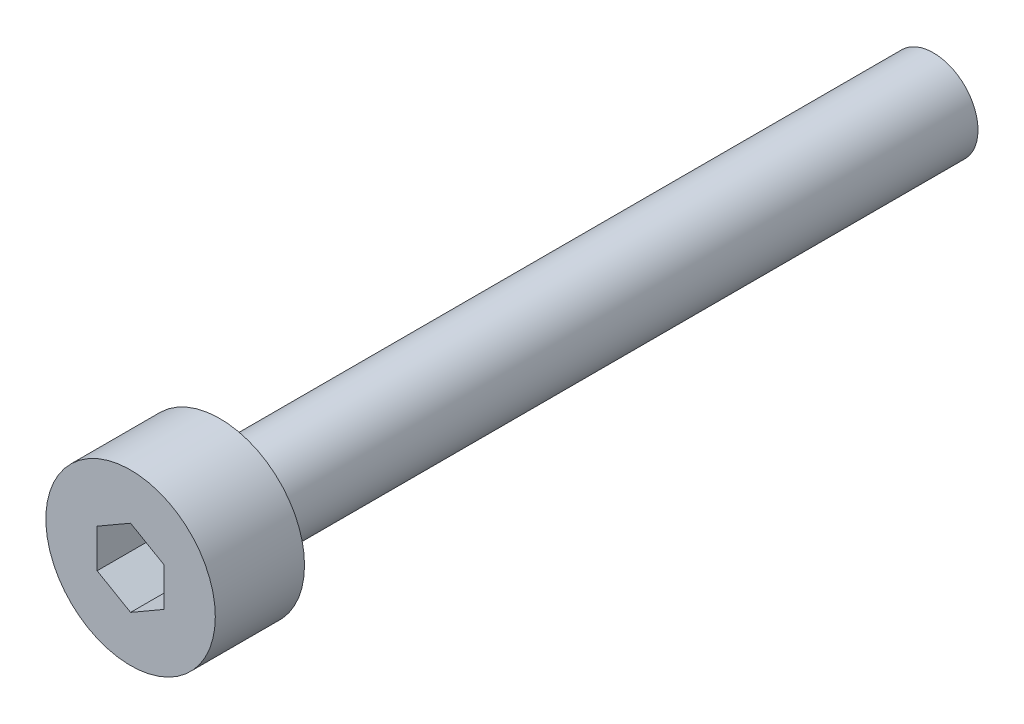
ISO-10303-21;
HEADER;
FILE_DESCRIPTION(('STEP AP214'),'2;1');
FILE_NAME('part.step','',(''),(''),'','','');
FILE_SCHEMA(('AUTOMOTIVE_DESIGN { 1 0 10303 214 1 1 1 1 }'));
ENDSEC;
DATA;
#1=APPLICATION_CONTEXT('core data for automotive mechanical design processes');
#2=APPLICATION_PROTOCOL_DEFINITION('international standard','automotive_design',2000,#1);
#3=PRODUCT_CONTEXT('',#1,'mechanical');
#4=PRODUCT('Part','Part','',(#3));
#5=PRODUCT_RELATED_PRODUCT_CATEGORY('part','',(#4));
#6=PRODUCT_DEFINITION_FORMATION('','',#4);
#7=PRODUCT_DEFINITION_CONTEXT('part definition',#1,'design');
#8=PRODUCT_DEFINITION('design','',#6,#7);
#9=PRODUCT_DEFINITION_SHAPE('','',#8);
#10=(LENGTH_UNIT() NAMED_UNIT(*) SI_UNIT(.MILLI.,.METRE.));
#11=(NAMED_UNIT(*) PLANE_ANGLE_UNIT() SI_UNIT($,.RADIAN.));
#12=(NAMED_UNIT(*) SI_UNIT($,.STERADIAN.) SOLID_ANGLE_UNIT());
#13=UNCERTAINTY_MEASURE_WITH_UNIT(LENGTH_MEASURE(1.E-05),#10,'distance_accuracy_value','');
#14=(GEOMETRIC_REPRESENTATION_CONTEXT(3) GLOBAL_UNCERTAINTY_ASSIGNED_CONTEXT((#13)) GLOBAL_UNIT_ASSIGNED_CONTEXT((#10,
#11,#12)) REPRESENTATION_CONTEXT('',''));
#15=CARTESIAN_POINT('',(0.,0.,0.));
#16=DIRECTION('',(0.,0.,1.));
#17=DIRECTION('',(1.,0.,0.));
#18=AXIS2_PLACEMENT_3D('',#15,#16,#17);
#19=CARTESIAN_POINT('',(-63.2916512459885,-5.5,21.2));
#20=DIRECTION('',(0.,0.,1.));
#21=DIRECTION('',(1.,0.,0.));
#22=AXIS2_PLACEMENT_3D('',#19,#20,#21);
#23=PLANE('',#22);
#24=CARTESIAN_POINT('',(-63.2916512459885,-5.5,21.2));
#25=DIRECTION('',(0.,0.,1.));
#26=DIRECTION('',(1.,0.,0.));
#27=AXIS2_PLACEMENT_3D('',#24,#25,#26);
#28=CIRCLE('',#27,1.9);
#29=CARTESIAN_POINT('',(-61.3916512459885,-5.5,21.2));
#30=VERTEX_POINT('',#29);
#31=EDGE_CURVE('E133',#30,#30,#28,.T.);
#32=ORIENTED_EDGE('',*,*,#31,.T.);
#33=EDGE_LOOP('',(#32));
#34=FACE_BOUND('',#33,.T.);
#35=DIRECTION('',(0.866025403784439,-0.499999999999999,0.));
#36=VECTOR('',#35,1.);
#37=CARTESIAN_POINT('',(-62.9166512459885,-4.85048094716167,21.2));
#38=LINE('',#37,#36);
#39=CARTESIAN_POINT('',(-63.2916512459885,-4.63397459621556,21.2));
#40=VERTEX_POINT('',#39);
#41=CARTESIAN_POINT('',(-62.5416512459885,-5.06698729810778,21.2));
#42=VERTEX_POINT('',#41);
#43=EDGE_CURVE('E47',#40,#42,#38,.T.);
#44=ORIENTED_EDGE('',*,*,#43,.T.);
#45=DIRECTION('',(0.,-1.,0.));
#46=VECTOR('',#45,1.);
#47=CARTESIAN_POINT('',(-62.5416512459885,-5.5,21.2));
#48=LINE('',#47,#46);
#49=CARTESIAN_POINT('',(-62.5416512459885,-5.93301270189222,21.2));
#50=VERTEX_POINT('',#49);
#51=EDGE_CURVE('E11',#42,#50,#48,.T.);
#52=ORIENTED_EDGE('',*,*,#51,.T.);
#53=DIRECTION('',(-0.866025403784439,-0.5,0.));
#54=VECTOR('',#53,1.);
#55=CARTESIAN_POINT('',(-62.9166512459885,-6.14951905283833,21.2));
#56=LINE('',#55,#54);
#57=CARTESIAN_POINT('',(-63.2916512459885,-6.36602540378444,21.2));
#58=VERTEX_POINT('',#57);
#59=EDGE_CURVE('E139',#50,#58,#56,.T.);
#60=ORIENTED_EDGE('',*,*,#59,.T.);
#61=DIRECTION('',(-0.866025403784439,0.5,0.));
#62=VECTOR('',#61,1.);
#63=CARTESIAN_POINT('',(-63.6666512459885,-6.14951905283833,21.2));
#64=LINE('',#63,#62);
#65=CARTESIAN_POINT('',(-64.0416512459885,-5.93301270189222,21.2));
#66=VERTEX_POINT('',#65);
#67=EDGE_CURVE('E144',#58,#66,#64,.T.);
#68=ORIENTED_EDGE('',*,*,#67,.T.);
#69=DIRECTION('',(0.,1.,0.));
#70=VECTOR('',#69,1.);
#71=CARTESIAN_POINT('',(-64.0416512459885,-5.5,21.2));
#72=LINE('',#71,#70);
#73=CARTESIAN_POINT('',(-64.0416512459885,-5.06698729810778,21.2));
#74=VERTEX_POINT('',#73);
#75=EDGE_CURVE('E146',#66,#74,#72,.T.);
#76=ORIENTED_EDGE('',*,*,#75,.T.);
#77=DIRECTION('',(0.866025403784439,0.499999999999999,0.));
#78=VECTOR('',#77,1.);
#79=CARTESIAN_POINT('',(-63.6666512459885,-4.85048094716167,21.2));
#80=LINE('',#79,#78);
#81=EDGE_CURVE('E151',#74,#40,#80,.T.);
#82=ORIENTED_EDGE('',*,*,#81,.T.);
#83=EDGE_LOOP('',(#44,#52,#60,#68,#76,#82));
#84=FACE_BOUND('',#83,.T.);
#85=ADVANCED_FACE('F41',(#34,#84),#23,.T.);
#86=CARTESIAN_POINT('',(-63.2916512459885,-5.5,19.2));
#87=DIRECTION('',(0.,0.,-1.));
#88=DIRECTION('',(-1.,0.,0.));
#89=AXIS2_PLACEMENT_3D('',#86,#87,#88);
#90=CYLINDRICAL_SURFACE('',#89,1.);
#91=CARTESIAN_POINT('',(-63.2916512459885,-5.5,19.2));
#92=DIRECTION('',(0.,0.,1.));
#93=DIRECTION('',(1.,0.,0.));
#94=AXIS2_PLACEMENT_3D('',#91,#92,#93);
#95=CIRCLE('',#94,1.);
#96=CARTESIAN_POINT('',(-62.2916512459885,-5.5,19.2));
#97=VERTEX_POINT('',#96);
#98=EDGE_CURVE('E140',#97,#97,#95,.T.);
#99=ORIENTED_EDGE('',*,*,#98,.F.);
#100=EDGE_LOOP('',(#99));
#101=FACE_BOUND('',#100,.T.);
#102=CARTESIAN_POINT('',(-63.2916512459885,-5.5,3.2));
#103=DIRECTION('',(0.,0.,1.));
#104=DIRECTION('',(1.,0.,0.));
#105=AXIS2_PLACEMENT_3D('',#102,#103,#104);
#106=CIRCLE('',#105,1.);
#107=CARTESIAN_POINT('',(-62.2916512459885,-5.5,3.2));
#108=VERTEX_POINT('',#107);
#109=EDGE_CURVE('E132',#108,#108,#106,.T.);
#110=ORIENTED_EDGE('',*,*,#109,.T.);
#111=EDGE_LOOP('',(#110));
#112=FACE_BOUND('',#111,.T.);
#113=ADVANCED_FACE('F43',(#101,#112),#90,.T.);
#114=CARTESIAN_POINT('',(-63.2916512459885,-5.5,3.2));
#115=DIRECTION('',(0.,0.,1.));
#116=DIRECTION('',(1.,0.,0.));
#117=AXIS2_PLACEMENT_3D('',#114,#115,#116);
#118=PLANE('',#117);
#119=ORIENTED_EDGE('',*,*,#109,.F.);
#120=EDGE_LOOP('',(#119));
#121=FACE_BOUND('',#120,.T.);
#122=ADVANCED_FACE('F182',(#121),#118,.F.);
#123=CARTESIAN_POINT('',(-63.2916512459885,-5.5,21.2));
#124=DIRECTION('',(0.,0.,-1.));
#125=DIRECTION('',(-1.,0.,0.));
#126=AXIS2_PLACEMENT_3D('',#123,#124,#125);
#127=CYLINDRICAL_SURFACE('',#126,1.9);
#128=ORIENTED_EDGE('',*,*,#31,.F.);
#129=EDGE_LOOP('',(#128));
#130=FACE_BOUND('',#129,.T.);
#131=CARTESIAN_POINT('',(-63.2916512459885,-5.5,19.2));
#132=DIRECTION('',(0.,0.,1.));
#133=DIRECTION('',(1.,0.,0.));
#134=AXIS2_PLACEMENT_3D('',#131,#132,#133);
#135=CIRCLE('',#134,1.9);
#136=CARTESIAN_POINT('',(-61.3916512459885,-5.5,19.2));
#137=VERTEX_POINT('',#136);
#138=EDGE_CURVE('E98',#137,#137,#135,.T.);
#139=ORIENTED_EDGE('',*,*,#138,.T.);
#140=EDGE_LOOP('',(#139));
#141=FACE_BOUND('',#140,.T.);
#142=ADVANCED_FACE('F186',(#130,#141),#127,.T.);
#143=CARTESIAN_POINT('',(-63.2916512459885,-5.5,19.2));
#144=DIRECTION('',(0.,0.,1.));
#145=DIRECTION('',(1.,0.,0.));
#146=AXIS2_PLACEMENT_3D('',#143,#144,#145);
#147=PLANE('',#146);
#148=ORIENTED_EDGE('',*,*,#98,.T.);
#149=EDGE_LOOP('',(#148));
#150=FACE_BOUND('',#149,.T.);
#151=ORIENTED_EDGE('',*,*,#138,.F.);
#152=EDGE_LOOP('',(#151));
#153=FACE_BOUND('',#152,.T.);
#154=ADVANCED_FACE('F188',(#150,#153),#147,.F.);
#155=CARTESIAN_POINT('',(-62.5416512459885,-5.93301270189222,21.3));
#156=DIRECTION('',(-1.,0.,0.));
#157=DIRECTION('',(0.,0.,1.));
#158=AXIS2_PLACEMENT_3D('',#155,#156,#157);
#159=PLANE('',#158);
#160=DIRECTION('',(0.,0.,-1.));
#161=VECTOR('',#160,1.);
#162=CARTESIAN_POINT('',(-62.5416512459885,-5.06698729810778,21.3));
#163=LINE('',#162,#161);
#164=CARTESIAN_POINT('',(-62.5416512459885,-5.06698729810778,20.1));
#165=VERTEX_POINT('',#164);
#166=EDGE_CURVE('E93',#42,#165,#163,.T.);
#167=ORIENTED_EDGE('',*,*,#166,.T.);
#168=DIRECTION('',(0.,1.,0.));
#169=VECTOR('',#168,1.);
#170=CARTESIAN_POINT('',(-62.5416512459885,-5.93301270189222,20.1));
#171=LINE('',#170,#169);
#172=CARTESIAN_POINT('',(-62.5416512459885,-5.93301270189222,20.1));
#173=VERTEX_POINT('',#172);
#174=EDGE_CURVE('E92',#173,#165,#171,.T.);
#175=ORIENTED_EDGE('',*,*,#174,.F.);
#176=DIRECTION('',(0.,0.,-1.));
#177=VECTOR('',#176,1.);
#178=CARTESIAN_POINT('',(-62.5416512459885,-5.93301270189222,21.3));
#179=LINE('',#178,#177);
#180=EDGE_CURVE('E122',#50,#173,#179,.T.);
#181=ORIENTED_EDGE('',*,*,#180,.F.);
#182=ORIENTED_EDGE('',*,*,#51,.F.);
#183=EDGE_LOOP('',(#167,#175,#181,#182));
#184=FACE_BOUND('',#183,.T.);
#185=ADVANCED_FACE('F91',(#184),#159,.T.);
#186=CARTESIAN_POINT('',(-62.5416512459885,-5.06698729810778,21.3));
#187=DIRECTION('',(-0.499999999999999,-0.866025403784439,0.));
#188=DIRECTION('',(0.866025403784439,-0.499999999999999,0.));
#189=AXIS2_PLACEMENT_3D('',#186,#187,#188);
#190=PLANE('',#189);
#191=DIRECTION('',(0.,0.,-1.));
#192=VECTOR('',#191,1.);
#193=CARTESIAN_POINT('',(-63.2916512459885,-4.63397459621556,21.3));
#194=LINE('',#193,#192);
#195=CARTESIAN_POINT('',(-63.2916512459885,-4.63397459621556,20.1));
#196=VERTEX_POINT('',#195);
#197=EDGE_CURVE('E97',#40,#196,#194,.T.);
#198=ORIENTED_EDGE('',*,*,#197,.T.);
#199=DIRECTION('',(-0.866025403784439,0.499999999999999,0.));
#200=VECTOR('',#199,1.);
#201=CARTESIAN_POINT('',(-62.5416512459885,-5.06698729810778,20.1));
#202=LINE('',#201,#200);
#203=EDGE_CURVE('E105',#165,#196,#202,.T.);
#204=ORIENTED_EDGE('',*,*,#203,.F.);
#205=ORIENTED_EDGE('',*,*,#166,.F.);
#206=ORIENTED_EDGE('',*,*,#43,.F.);
#207=EDGE_LOOP('',(#198,#204,#205,#206));
#208=FACE_BOUND('',#207,.T.);
#209=ADVANCED_FACE('F103',(#208),#190,.T.);
#210=CARTESIAN_POINT('',(-63.2916512459885,-4.63397459621556,21.3));
#211=DIRECTION('',(0.499999999999999,-0.866025403784439,0.));
#212=DIRECTION('',(0.866025403784439,0.499999999999999,0.));
#213=AXIS2_PLACEMENT_3D('',#210,#211,#212);
#214=PLANE('',#213);
#215=DIRECTION('',(0.,0.,-1.));
#216=VECTOR('',#215,1.);
#217=CARTESIAN_POINT('',(-64.0416512459885,-5.06698729810778,21.3));
#218=LINE('',#217,#216);
#219=CARTESIAN_POINT('',(-64.0416512459885,-5.06698729810778,20.1));
#220=VERTEX_POINT('',#219);
#221=EDGE_CURVE('E126',#74,#220,#218,.T.);
#222=ORIENTED_EDGE('',*,*,#221,.T.);
#223=DIRECTION('',(-0.866025403784439,-0.499999999999999,0.));
#224=VECTOR('',#223,1.);
#225=CARTESIAN_POINT('',(-63.2916512459885,-4.63397459621556,20.1));
#226=LINE('',#225,#224);
#227=EDGE_CURVE('E107',#196,#220,#226,.T.);
#228=ORIENTED_EDGE('',*,*,#227,.F.);
#229=ORIENTED_EDGE('',*,*,#197,.F.);
#230=ORIENTED_EDGE('',*,*,#81,.F.);
#231=EDGE_LOOP('',(#222,#228,#229,#230));
#232=FACE_BOUND('',#231,.T.);
#233=ADVANCED_FACE('F154',(#232),#214,.T.);
#234=CARTESIAN_POINT('',(-64.0416512459885,-5.06698729810778,21.3));
#235=DIRECTION('',(1.,0.,0.));
#236=DIRECTION('',(0.,0.,-1.));
#237=AXIS2_PLACEMENT_3D('',#234,#235,#236);
#238=PLANE('',#237);
#239=DIRECTION('',(0.,0.,-1.));
#240=VECTOR('',#239,1.);
#241=CARTESIAN_POINT('',(-64.0416512459885,-5.93301270189222,21.3));
#242=LINE('',#241,#240);
#243=CARTESIAN_POINT('',(-64.0416512459885,-5.93301270189222,20.1));
#244=VERTEX_POINT('',#243);
#245=EDGE_CURVE('E127',#66,#244,#242,.T.);
#246=ORIENTED_EDGE('',*,*,#245,.T.);
#247=DIRECTION('',(0.,-1.,0.));
#248=VECTOR('',#247,1.);
#249=CARTESIAN_POINT('',(-64.0416512459885,-5.06698729810778,20.1));
#250=LINE('',#249,#248);
#251=EDGE_CURVE('E120',#220,#244,#250,.T.);
#252=ORIENTED_EDGE('',*,*,#251,.F.);
#253=ORIENTED_EDGE('',*,*,#221,.F.);
#254=ORIENTED_EDGE('',*,*,#75,.F.);
#255=EDGE_LOOP('',(#246,#252,#253,#254));
#256=FACE_BOUND('',#255,.T.);
#257=ADVANCED_FACE('F159',(#256),#238,.T.);
#258=CARTESIAN_POINT('',(-64.0416512459885,-5.93301270189222,21.3));
#259=DIRECTION('',(0.5,0.866025403784439,0.));
#260=DIRECTION('',(-0.866025403784439,0.5,0.));
#261=AXIS2_PLACEMENT_3D('',#258,#259,#260);
#262=PLANE('',#261);
#263=DIRECTION('',(0.,0.,-1.));
#264=VECTOR('',#263,1.);
#265=CARTESIAN_POINT('',(-63.2916512459885,-6.36602540378444,21.3));
#266=LINE('',#265,#264);
#267=CARTESIAN_POINT('',(-63.2916512459885,-6.36602540378444,20.1));
#268=VERTEX_POINT('',#267);
#269=EDGE_CURVE('E57',#58,#268,#266,.T.);
#270=ORIENTED_EDGE('',*,*,#269,.T.);
#271=DIRECTION('',(0.866025403784439,-0.5,0.));
#272=VECTOR('',#271,1.);
#273=CARTESIAN_POINT('',(-64.0416512459885,-5.93301270189222,20.1));
#274=LINE('',#273,#272);
#275=EDGE_CURVE('E119',#244,#268,#274,.T.);
#276=ORIENTED_EDGE('',*,*,#275,.F.);
#277=ORIENTED_EDGE('',*,*,#245,.F.);
#278=ORIENTED_EDGE('',*,*,#67,.F.);
#279=EDGE_LOOP('',(#270,#276,#277,#278));
#280=FACE_BOUND('',#279,.T.);
#281=ADVANCED_FACE('F162',(#280),#262,.T.);
#282=CARTESIAN_POINT('',(-63.2916512459885,-6.36602540378444,21.3));
#283=DIRECTION('',(-0.5,0.866025403784439,0.));
#284=DIRECTION('',(-0.866025403784439,-0.5,0.));
#285=AXIS2_PLACEMENT_3D('',#282,#283,#284);
#286=PLANE('',#285);
#287=ORIENTED_EDGE('',*,*,#180,.T.);
#288=DIRECTION('',(0.866025403784439,0.5,0.));
#289=VECTOR('',#288,1.);
#290=CARTESIAN_POINT('',(-63.2916512459885,-6.36602540378444,20.1));
#291=LINE('',#290,#289);
#292=EDGE_CURVE('E114',#268,#173,#291,.T.);
#293=ORIENTED_EDGE('',*,*,#292,.F.);
#294=ORIENTED_EDGE('',*,*,#269,.F.);
#295=ORIENTED_EDGE('',*,*,#59,.F.);
#296=EDGE_LOOP('',(#287,#293,#294,#295));
#297=FACE_BOUND('',#296,.T.);
#298=ADVANCED_FACE('F163',(#297),#286,.T.);
#299=CARTESIAN_POINT('',(0.,0.,20.1));
#300=DIRECTION('',(0.,0.,1.));
#301=DIRECTION('',(1.,0.,0.));
#302=AXIS2_PLACEMENT_3D('',#299,#300,#301);
#303=PLANE('',#302);
#304=ORIENTED_EDGE('',*,*,#174,.T.);
#305=ORIENTED_EDGE('',*,*,#203,.T.);
#306=ORIENTED_EDGE('',*,*,#227,.T.);
#307=ORIENTED_EDGE('',*,*,#251,.T.);
#308=ORIENTED_EDGE('',*,*,#275,.T.);
#309=ORIENTED_EDGE('',*,*,#292,.T.);
#310=EDGE_LOOP('',(#304,#305,#306,#307,#308,#309));
#311=FACE_BOUND('',#310,.T.);
#312=ADVANCED_FACE('F112',(#311),#303,.T.);
#313=CLOSED_SHELL('',(#85,#113,#122,#142,#154,#185,#209,#233,#257,#281,#298,#312));
#314=MANIFOLD_SOLID_BREP('B2',#313);
#315=ADVANCED_BREP_SHAPE_REPRESENTATION('',(#18,#314),#14);
#316=SHAPE_DEFINITION_REPRESENTATION(#9,#315);
ENDSEC;
END-ISO-10303-21;
